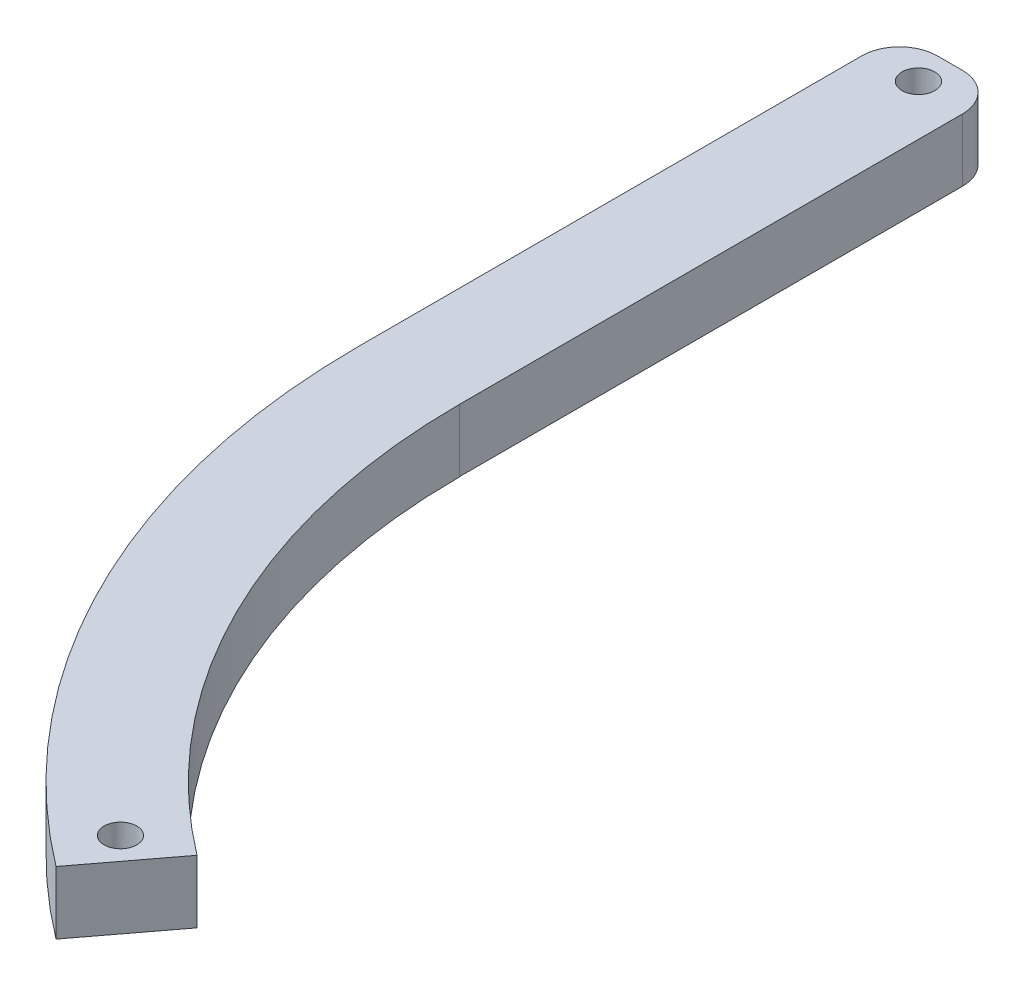
ISO-10303-21;
HEADER;
FILE_DESCRIPTION(('STEP AP214'),'2;1');
FILE_NAME('part.step','',(''),(''),'','','');
FILE_SCHEMA(('AUTOMOTIVE_DESIGN { 1 0 10303 214 1 1 1 1 }'));
ENDSEC;
DATA;
#1=APPLICATION_CONTEXT('core data for automotive mechanical design processes');
#2=APPLICATION_PROTOCOL_DEFINITION('international standard','automotive_design',2000,#1);
#3=PRODUCT_CONTEXT('',#1,'mechanical');
#4=PRODUCT('Part','Part','',(#3));
#5=PRODUCT_RELATED_PRODUCT_CATEGORY('part','',(#4));
#6=PRODUCT_DEFINITION_FORMATION('','',#4);
#7=PRODUCT_DEFINITION_CONTEXT('part definition',#1,'design');
#8=PRODUCT_DEFINITION('design','',#6,#7);
#9=PRODUCT_DEFINITION_SHAPE('','',#8);
#10=(LENGTH_UNIT() NAMED_UNIT(*) SI_UNIT(.MILLI.,.METRE.));
#11=(NAMED_UNIT(*) PLANE_ANGLE_UNIT() SI_UNIT($,.RADIAN.));
#12=(NAMED_UNIT(*) SI_UNIT($,.STERADIAN.) SOLID_ANGLE_UNIT());
#13=UNCERTAINTY_MEASURE_WITH_UNIT(LENGTH_MEASURE(1.E-05),#10,'distance_accuracy_value','');
#14=(GEOMETRIC_REPRESENTATION_CONTEXT(3) GLOBAL_UNCERTAINTY_ASSIGNED_CONTEXT((#13)) GLOBAL_UNIT_ASSIGNED_CONTEXT((#10,
#11,#12)) REPRESENTATION_CONTEXT('',''));
#15=CARTESIAN_POINT('',(0.,0.,0.));
#16=DIRECTION('',(0.,0.,1.));
#17=DIRECTION('',(1.,0.,0.));
#18=AXIS2_PLACEMENT_3D('',#15,#16,#17);
#19=CARTESIAN_POINT('',(0.,6.35,0.));
#20=DIRECTION('',(0.,-1.,0.));
#21=DIRECTION('',(0.,0.,-1.));
#22=AXIS2_PLACEMENT_3D('',#19,#20,#21);
#23=CYLINDRICAL_SURFACE('',#22,66.04);
#24=CARTESIAN_POINT('',(0.,0.,0.));
#25=DIRECTION('',(0.,1.,0.));
#26=DIRECTION('',(0.,0.,1.));
#27=AXIS2_PLACEMENT_3D('',#24,#25,#26);
#28=CIRCLE('',#27,66.04);
#29=CARTESIAN_POINT('',(-66.04,0.,0.));
#30=VERTEX_POINT('',#29);
#31=CARTESIAN_POINT('',(-39.8667137310688,0.,52.6490905551559));
#32=VERTEX_POINT('',#31);
#33=EDGE_CURVE('E170',#30,#32,#28,.T.);
#34=ORIENTED_EDGE('',*,*,#33,.F.);
#35=DIRECTION('',(0.,-1.,0.));
#36=VECTOR('',#35,1.);
#37=CARTESIAN_POINT('',(-66.04,6.35,0.));
#38=LINE('',#37,#36);
#39=CARTESIAN_POINT('',(-66.04,0.0233043380153857,0.));
#40=VERTEX_POINT('',#39);
#41=EDGE_CURVE('E136',#40,#30,#38,.T.);
#42=ORIENTED_EDGE('',*,*,#41,.F.);
#43=CARTESIAN_POINT('',(-66.04,6.35,0.));
#44=VERTEX_POINT('',#43);
#45=EDGE_CURVE('E198',#44,#40,#38,.T.);
#46=ORIENTED_EDGE('',*,*,#45,.F.);
#47=CARTESIAN_POINT('',(0.,6.35,0.));
#48=DIRECTION('',(0.,1.,0.));
#49=DIRECTION('',(0.,0.,1.));
#50=AXIS2_PLACEMENT_3D('',#47,#48,#49);
#51=CIRCLE('',#50,66.04);
#52=CARTESIAN_POINT('',(-39.8667137310688,6.35,52.6490905551559));
#53=VERTEX_POINT('',#52);
#54=EDGE_CURVE('E171',#44,#53,#51,.T.);
#55=ORIENTED_EDGE('',*,*,#54,.T.);
#56=DIRECTION('',(0.,-1.,0.));
#57=VECTOR('',#56,1.);
#58=CARTESIAN_POINT('',(-39.8667137310688,6.35,52.6490905551559));
#59=LINE('',#58,#57);
#60=EDGE_CURVE('E181',#53,#32,#59,.T.);
#61=ORIENTED_EDGE('',*,*,#60,.T.);
#62=EDGE_LOOP('',(#34,#42,#46,#55,#61));
#63=FACE_BOUND('',#62,.T.);
#64=ADVANCED_FACE('F47',(#63),#23,.F.);
#65=CARTESIAN_POINT('',(0.,6.35,0.));
#66=DIRECTION('',(0.,0.,-1.));
#67=DIRECTION('',(-1.,0.,0.));
#68=AXIS2_PLACEMENT_3D('',#65,#66,#67);
#69=PLANE('',#68);
#70=DIRECTION('',(-1.,0.,0.));
#71=VECTOR('',#70,1.);
#72=CARTESIAN_POINT('',(-66.04,0.0233043380153857,0.));
#73=LINE('',#72,#71);
#74=CARTESIAN_POINT('',(-76.2,0.0233043380153857,0.));
#75=VERTEX_POINT('',#74);
#76=EDGE_CURVE('E142',#40,#75,#73,.T.);
#77=ORIENTED_EDGE('',*,*,#76,.F.);
#78=ORIENTED_EDGE('',*,*,#41,.T.);
#79=DIRECTION('',(1.,0.,0.));
#80=VECTOR('',#79,1.);
#81=CARTESIAN_POINT('',(0.,0.,0.));
#82=LINE('',#81,#80);
#83=CARTESIAN_POINT('',(-76.2,0.,0.));
#84=VERTEX_POINT('',#83);
#85=EDGE_CURVE('E145',#84,#30,#82,.T.);
#86=ORIENTED_EDGE('',*,*,#85,.F.);
#87=DIRECTION('',(0.,-1.,0.));
#88=VECTOR('',#87,1.);
#89=CARTESIAN_POINT('',(-76.2,6.35,0.));
#90=LINE('',#89,#88);
#91=EDGE_CURVE('E131',#75,#84,#90,.T.);
#92=ORIENTED_EDGE('',*,*,#91,.F.);
#93=EDGE_LOOP('',(#77,#78,#86,#92));
#94=FACE_BOUND('',#93,.T.);
#95=ADVANCED_FACE('F141',(#94),#69,.T.);
#96=CARTESIAN_POINT('',(0.,6.35,0.));
#97=DIRECTION('',(0.,-1.,0.));
#98=DIRECTION('',(0.,0.,-1.));
#99=AXIS2_PLACEMENT_3D('',#96,#97,#98);
#100=CYLINDRICAL_SURFACE('',#99,76.2);
#101=CARTESIAN_POINT('',(0.,0.,0.));
#102=DIRECTION('',(0.,1.,0.));
#103=DIRECTION('',(0.,0.,1.));
#104=AXIS2_PLACEMENT_3D('',#101,#102,#103);
#105=CIRCLE('',#104,76.2);
#106=CARTESIAN_POINT('',(-46.0000543050794,0.,60.7489506405645));
#107=VERTEX_POINT('',#106);
#108=EDGE_CURVE('E187',#84,#107,#105,.T.);
#109=ORIENTED_EDGE('',*,*,#108,.T.);
#110=DIRECTION('',(0.,-1.,0.));
#111=VECTOR('',#110,1.);
#112=CARTESIAN_POINT('',(-46.0000543050794,6.35,60.7489506405645));
#113=LINE('',#112,#111);
#114=CARTESIAN_POINT('',(-46.0000543050794,6.35,60.7489506405645));
#115=VERTEX_POINT('',#114);
#116=EDGE_CURVE('E147',#115,#107,#113,.T.);
#117=ORIENTED_EDGE('',*,*,#116,.F.);
#118=CARTESIAN_POINT('',(0.,6.35,0.));
#119=DIRECTION('',(0.,1.,0.));
#120=DIRECTION('',(0.,0.,1.));
#121=AXIS2_PLACEMENT_3D('',#118,#119,#120);
#122=CIRCLE('',#121,76.2);
#123=CARTESIAN_POINT('',(-76.2,6.35,0.));
#124=VERTEX_POINT('',#123);
#125=EDGE_CURVE('E134',#124,#115,#122,.T.);
#126=ORIENTED_EDGE('',*,*,#125,.F.);
#127=EDGE_CURVE('E120',#124,#75,#90,.T.);
#128=ORIENTED_EDGE('',*,*,#127,.T.);
#129=ORIENTED_EDGE('',*,*,#91,.T.);
#130=EDGE_LOOP('',(#109,#117,#126,#128,#129));
#131=FACE_BOUND('',#130,.T.);
#132=ADVANCED_FACE('F130',(#131),#100,.T.);
#133=CARTESIAN_POINT('',(0.,6.35,0.));
#134=DIRECTION('',(-0.797230323366988,0.,-0.603675253347499));
#135=DIRECTION('',(-0.603675253347499,0.,0.797230323366988));
#136=AXIS2_PLACEMENT_3D('',#133,#134,#135);
#137=PLANE('',#136);
#138=DIRECTION('',(0.603675253347499,0.,-0.797230323366988));
#139=VECTOR('',#138,1.);
#140=CARTESIAN_POINT('',(0.,0.,0.));
#141=LINE('',#140,#139);
#142=EDGE_CURVE('E175',#107,#32,#141,.T.);
#143=ORIENTED_EDGE('',*,*,#142,.T.);
#144=ORIENTED_EDGE('',*,*,#60,.F.);
#145=DIRECTION('',(0.603675253347499,0.,-0.797230323366988));
#146=VECTOR('',#145,1.);
#147=CARTESIAN_POINT('',(0.,6.35,0.));
#148=LINE('',#147,#146);
#149=EDGE_CURVE('E178',#115,#53,#148,.T.);
#150=ORIENTED_EDGE('',*,*,#149,.F.);
#151=ORIENTED_EDGE('',*,*,#116,.T.);
#152=EDGE_LOOP('',(#143,#144,#150,#151));
#153=FACE_BOUND('',#152,.T.);
#154=ADVANCED_FACE('F248',(#153),#137,.F.);
#155=CARTESIAN_POINT('',(0.,6.35,0.));
#156=DIRECTION('',(0.,1.,0.));
#157=DIRECTION('',(0.,0.,1.));
#158=AXIS2_PLACEMENT_3D('',#155,#156,#157);
#159=PLANE('',#158);
#160=CARTESIAN_POINT('',(-45.4645902947643,6.35,54.7823516684819));
#161=DIRECTION('',(0.,1.,0.));
#162=DIRECTION('',(0.,0.,1.));
#163=AXIS2_PLACEMENT_3D('',#160,#161,#162);
#164=CIRCLE('',#163,1.651);
#165=CARTESIAN_POINT('',(-45.4645902947643,6.35,56.4333516684819));
#166=VERTEX_POINT('',#165);
#167=EDGE_CURVE('E207',#166,#166,#164,.T.);
#168=ORIENTED_EDGE('',*,*,#167,.F.);
#169=EDGE_LOOP('',(#168));
#170=FACE_BOUND('',#169,.T.);
#171=CARTESIAN_POINT('',(-71.12,6.35,-51.435));
#172=DIRECTION('',(0.,1.,0.));
#173=DIRECTION('',(0.,0.,1.));
#174=AXIS2_PLACEMENT_3D('',#171,#172,#173);
#175=CIRCLE('',#174,1.65100000000001);
#176=CARTESIAN_POINT('',(-71.12,6.35,-49.784));
#177=VERTEX_POINT('',#176);
#178=EDGE_CURVE('E159',#177,#177,#175,.T.);
#179=ORIENTED_EDGE('',*,*,#178,.F.);
#180=EDGE_LOOP('',(#179));
#181=FACE_BOUND('',#180,.T.);
#182=DIRECTION('',(1.,0.,0.));
#183=VECTOR('',#182,1.);
#184=CARTESIAN_POINT('',(-66.04,6.35,-54.61));
#185=LINE('',#184,#183);
#186=CARTESIAN_POINT('',(-72.39,6.35,-54.61));
#187=VERTEX_POINT('',#186);
#188=CARTESIAN_POINT('',(-69.85,6.35,-54.61));
#189=VERTEX_POINT('',#188);
#190=EDGE_CURVE('E156',#187,#189,#185,.T.);
#191=ORIENTED_EDGE('',*,*,#190,.F.);
#192=CARTESIAN_POINT('',(-72.39,6.35,-50.8));
#193=DIRECTION('',(0.,1.,0.));
#194=DIRECTION('',(0.,0.,1.));
#195=AXIS2_PLACEMENT_3D('',#192,#193,#194);
#196=CIRCLE('',#195,3.81);
#197=CARTESIAN_POINT('',(-76.2,6.35,-50.8));
#198=VERTEX_POINT('',#197);
#199=EDGE_CURVE('E218',#187,#198,#196,.T.);
#200=ORIENTED_EDGE('',*,*,#199,.T.);
#201=DIRECTION('',(0.,0.,1.));
#202=VECTOR('',#201,1.);
#203=CARTESIAN_POINT('',(-76.2,6.35,-54.61));
#204=LINE('',#203,#202);
#205=EDGE_CURVE('E125',#198,#124,#204,.T.);
#206=ORIENTED_EDGE('',*,*,#205,.T.);
#207=ORIENTED_EDGE('',*,*,#125,.T.);
#208=ORIENTED_EDGE('',*,*,#149,.T.);
#209=ORIENTED_EDGE('',*,*,#54,.F.);
#210=DIRECTION('',(0.,0.,1.));
#211=VECTOR('',#210,1.);
#212=CARTESIAN_POINT('',(-66.04,6.35,-54.61));
#213=LINE('',#212,#211);
#214=CARTESIAN_POINT('',(-66.04,6.35,-50.8));
#215=VERTEX_POINT('',#214);
#216=EDGE_CURVE('E163',#215,#44,#213,.T.);
#217=ORIENTED_EDGE('',*,*,#216,.F.);
#218=CARTESIAN_POINT('',(-69.85,6.35,-50.8));
#219=DIRECTION('',(0.,1.,0.));
#220=DIRECTION('',(0.,0.,1.));
#221=AXIS2_PLACEMENT_3D('',#218,#219,#220);
#222=CIRCLE('',#221,3.81);
#223=EDGE_CURVE('E215',#215,#189,#222,.T.);
#224=ORIENTED_EDGE('',*,*,#223,.T.);
#225=EDGE_LOOP('',(#191,#200,#206,#207,#208,#209,#217,#224));
#226=FACE_BOUND('',#225,.T.);
#227=ADVANCED_FACE('F234',(#170,#181,#226),#159,.T.);
#228=CARTESIAN_POINT('',(0.,0.,0.));
#229=DIRECTION('',(0.,1.,0.));
#230=DIRECTION('',(0.,0.,1.));
#231=AXIS2_PLACEMENT_3D('',#228,#229,#230);
#232=PLANE('',#231);
#233=CARTESIAN_POINT('',(-45.4645902947643,0.,54.7823516684819));
#234=DIRECTION('',(0.,1.,0.));
#235=DIRECTION('',(0.,0.,1.));
#236=AXIS2_PLACEMENT_3D('',#233,#234,#235);
#237=CIRCLE('',#236,1.651);
#238=CARTESIAN_POINT('',(-45.4645902947643,0.,56.4333516684819));
#239=VERTEX_POINT('',#238);
#240=EDGE_CURVE('E203',#239,#239,#237,.T.);
#241=ORIENTED_EDGE('',*,*,#240,.T.);
#242=EDGE_LOOP('',(#241));
#243=FACE_BOUND('',#242,.T.);
#244=ORIENTED_EDGE('',*,*,#33,.T.);
#245=ORIENTED_EDGE('',*,*,#142,.F.);
#246=ORIENTED_EDGE('',*,*,#108,.F.);
#247=ORIENTED_EDGE('',*,*,#85,.T.);
#248=EDGE_LOOP('',(#244,#245,#246,#247));
#249=FACE_BOUND('',#248,.T.);
#250=ADVANCED_FACE('F245',(#243,#249),#232,.F.);
#251=CARTESIAN_POINT('',(-66.04,6.35,-54.61));
#252=DIRECTION('',(-1.,0.,0.));
#253=DIRECTION('',(0.,0.,1.));
#254=AXIS2_PLACEMENT_3D('',#251,#252,#253);
#255=PLANE('',#254);
#256=DIRECTION('',(0.,0.,1.));
#257=VECTOR('',#256,1.);
#258=CARTESIAN_POINT('',(-66.04,0.0233043380153857,-54.61));
#259=LINE('',#258,#257);
#260=CARTESIAN_POINT('',(-66.04,0.0233043380153857,-50.8));
#261=VERTEX_POINT('',#260);
#262=EDGE_CURVE('E124',#261,#40,#259,.T.);
#263=ORIENTED_EDGE('',*,*,#262,.F.);
#264=DIRECTION('',(0.,-1.,0.));
#265=VECTOR('',#264,1.);
#266=CARTESIAN_POINT('',(-66.04,6.35,-50.8));
#267=LINE('',#266,#265);
#268=EDGE_CURVE('E11',#261,#215,#267,.F.);
#269=ORIENTED_EDGE('',*,*,#268,.T.);
#270=ORIENTED_EDGE('',*,*,#216,.T.);
#271=ORIENTED_EDGE('',*,*,#45,.T.);
#272=EDGE_LOOP('',(#263,#269,#270,#271));
#273=FACE_BOUND('',#272,.T.);
#274=ADVANCED_FACE('F251',(#273),#255,.F.);
#275=CARTESIAN_POINT('',(-66.04,0.0233043380153857,-54.61));
#276=DIRECTION('',(0.,1.,0.));
#277=DIRECTION('',(0.,0.,1.));
#278=AXIS2_PLACEMENT_3D('',#275,#276,#277);
#279=PLANE('',#278);
#280=CARTESIAN_POINT('',(-71.12,0.0233043380153857,-51.435));
#281=DIRECTION('',(0.,1.,0.));
#282=DIRECTION('',(0.,0.,1.));
#283=AXIS2_PLACEMENT_3D('',#280,#281,#282);
#284=CIRCLE('',#283,1.65100000000001);
#285=CARTESIAN_POINT('',(-71.12,0.0233043380153857,-49.784));
#286=VERTEX_POINT('',#285);
#287=EDGE_CURVE('E151',#286,#286,#284,.T.);
#288=ORIENTED_EDGE('',*,*,#287,.T.);
#289=EDGE_LOOP('',(#288));
#290=FACE_BOUND('',#289,.T.);
#291=DIRECTION('',(0.,0.,1.));
#292=VECTOR('',#291,1.);
#293=CARTESIAN_POINT('',(-76.2,0.0233043380153857,-54.61));
#294=LINE('',#293,#292);
#295=CARTESIAN_POINT('',(-76.2,0.0233043380153857,-50.8));
#296=VERTEX_POINT('',#295);
#297=EDGE_CURVE('E117',#296,#75,#294,.T.);
#298=ORIENTED_EDGE('',*,*,#297,.F.);
#299=CARTESIAN_POINT('',(-72.39,0.0233043380153857,-50.8));
#300=DIRECTION('',(0.,1.,0.));
#301=DIRECTION('',(0.,0.,1.));
#302=AXIS2_PLACEMENT_3D('',#299,#300,#301);
#303=CIRCLE('',#302,3.81);
#304=CARTESIAN_POINT('',(-72.39,0.0233043380153857,-54.61));
#305=VERTEX_POINT('',#304);
#306=EDGE_CURVE('E56',#296,#305,#303,.F.);
#307=ORIENTED_EDGE('',*,*,#306,.T.);
#308=DIRECTION('',(-1.,0.,0.));
#309=VECTOR('',#308,1.);
#310=CARTESIAN_POINT('',(-66.04,0.0233043380153857,-54.61));
#311=LINE('',#310,#309);
#312=CARTESIAN_POINT('',(-69.85,0.0233043380153857,-54.61));
#313=VERTEX_POINT('',#312);
#314=EDGE_CURVE('E150',#313,#305,#311,.T.);
#315=ORIENTED_EDGE('',*,*,#314,.F.);
#316=CARTESIAN_POINT('',(-69.85,0.0233043380153857,-50.8));
#317=DIRECTION('',(0.,1.,0.));
#318=DIRECTION('',(0.,0.,1.));
#319=AXIS2_PLACEMENT_3D('',#316,#317,#318);
#320=CIRCLE('',#319,3.81);
#321=EDGE_CURVE('E63',#313,#261,#320,.F.);
#322=ORIENTED_EDGE('',*,*,#321,.T.);
#323=ORIENTED_EDGE('',*,*,#262,.T.);
#324=ORIENTED_EDGE('',*,*,#76,.T.);
#325=EDGE_LOOP('',(#298,#307,#315,#322,#323,#324));
#326=FACE_BOUND('',#325,.T.);
#327=ADVANCED_FACE('F148',(#290,#326),#279,.F.);
#328=CARTESIAN_POINT('',(-76.2,6.35,-54.61));
#329=DIRECTION('',(1.,0.,0.));
#330=DIRECTION('',(0.,0.,-1.));
#331=AXIS2_PLACEMENT_3D('',#328,#329,#330);
#332=PLANE('',#331);
#333=ORIENTED_EDGE('',*,*,#205,.F.);
#334=DIRECTION('',(0.,1.,0.));
#335=VECTOR('',#334,1.);
#336=CARTESIAN_POINT('',(-76.2,0.0233043380153857,-50.8));
#337=LINE('',#336,#335);
#338=EDGE_CURVE('E71',#198,#296,#337,.F.);
#339=ORIENTED_EDGE('',*,*,#338,.T.);
#340=ORIENTED_EDGE('',*,*,#297,.T.);
#341=ORIENTED_EDGE('',*,*,#127,.F.);
#342=EDGE_LOOP('',(#333,#339,#340,#341));
#343=FACE_BOUND('',#342,.T.);
#344=ADVANCED_FACE('F119',(#343),#332,.F.);
#345=CARTESIAN_POINT('',(0.,0.,-54.61));
#346=DIRECTION('',(0.,0.,-1.));
#347=DIRECTION('',(-1.,0.,0.));
#348=AXIS2_PLACEMENT_3D('',#345,#346,#347);
#349=PLANE('',#348);
#350=ORIENTED_EDGE('',*,*,#314,.T.);
#351=DIRECTION('',(0.,1.,0.));
#352=VECTOR('',#351,1.);
#353=CARTESIAN_POINT('',(-72.39,6.35,-54.61));
#354=LINE('',#353,#352);
#355=EDGE_CURVE('E211',#305,#187,#354,.T.);
#356=ORIENTED_EDGE('',*,*,#355,.T.);
#357=ORIENTED_EDGE('',*,*,#190,.T.);
#358=DIRECTION('',(0.,-1.,0.));
#359=VECTOR('',#358,1.);
#360=CARTESIAN_POINT('',(-69.85,0.0233043380153857,-54.61));
#361=LINE('',#360,#359);
#362=EDGE_CURVE('E201',#189,#313,#361,.T.);
#363=ORIENTED_EDGE('',*,*,#362,.T.);
#364=EDGE_LOOP('',(#350,#356,#357,#363));
#365=FACE_BOUND('',#364,.T.);
#366=ADVANCED_FACE('F228',(#365),#349,.T.);
#367=CARTESIAN_POINT('',(-71.12,0.,-51.435));
#368=DIRECTION('',(0.,1.,0.));
#369=DIRECTION('',(0.,0.,1.));
#370=AXIS2_PLACEMENT_3D('',#367,#368,#369);
#371=CYLINDRICAL_SURFACE('',#370,1.65100000000001);
#372=ORIENTED_EDGE('',*,*,#178,.T.);
#373=EDGE_LOOP('',(#372));
#374=FACE_BOUND('',#373,.T.);
#375=ORIENTED_EDGE('',*,*,#287,.F.);
#376=EDGE_LOOP('',(#375));
#377=FACE_BOUND('',#376,.T.);
#378=ADVANCED_FACE('F285',(#374,#377),#371,.F.);
#379=CARTESIAN_POINT('',(-45.4645902947643,-16.256,54.7823516684819));
#380=DIRECTION('',(0.,1.,0.));
#381=DIRECTION('',(0.,0.,1.));
#382=AXIS2_PLACEMENT_3D('',#379,#380,#381);
#383=CYLINDRICAL_SURFACE('',#382,1.651);
#384=ORIENTED_EDGE('',*,*,#167,.T.);
#385=EDGE_LOOP('',(#384));
#386=FACE_BOUND('',#385,.T.);
#387=ORIENTED_EDGE('',*,*,#240,.F.);
#388=EDGE_LOOP('',(#387));
#389=FACE_BOUND('',#388,.T.);
#390=ADVANCED_FACE('F258',(#386,#389),#383,.F.);
#391=CARTESIAN_POINT('',(-72.39,0.,-50.8));
#392=DIRECTION('',(0.,-1.,0.));
#393=DIRECTION('',(0.,0.,-1.));
#394=AXIS2_PLACEMENT_3D('',#391,#392,#393);
#395=CYLINDRICAL_SURFACE('',#394,3.81);
#396=ORIENTED_EDGE('',*,*,#306,.F.);
#397=ORIENTED_EDGE('',*,*,#338,.F.);
#398=ORIENTED_EDGE('',*,*,#199,.F.);
#399=ORIENTED_EDGE('',*,*,#355,.F.);
#400=EDGE_LOOP('',(#396,#397,#398,#399));
#401=FACE_BOUND('',#400,.T.);
#402=ADVANCED_FACE('F232',(#401),#395,.T.);
#403=CARTESIAN_POINT('',(-69.85,0.,-50.8));
#404=DIRECTION('',(0.,1.,0.));
#405=DIRECTION('',(0.,0.,1.));
#406=AXIS2_PLACEMENT_3D('',#403,#404,#405);
#407=CYLINDRICAL_SURFACE('',#406,3.81);
#408=ORIENTED_EDGE('',*,*,#223,.F.);
#409=ORIENTED_EDGE('',*,*,#268,.F.);
#410=ORIENTED_EDGE('',*,*,#321,.F.);
#411=ORIENTED_EDGE('',*,*,#362,.F.);
#412=EDGE_LOOP('',(#408,#409,#410,#411));
#413=FACE_BOUND('',#412,.T.);
#414=ADVANCED_FACE('F49',(#413),#407,.T.);
#415=CLOSED_SHELL('',(#64,#95,#132,#154,#227,#250,#274,#327,#344,#366,#378,#390,#402,#414));
#416=MANIFOLD_SOLID_BREP('B2',#415);
#417=ADVANCED_BREP_SHAPE_REPRESENTATION('',(#18,#416),#14);
#418=SHAPE_DEFINITION_REPRESENTATION(#9,#417);
ENDSEC;
END-ISO-10303-21;
